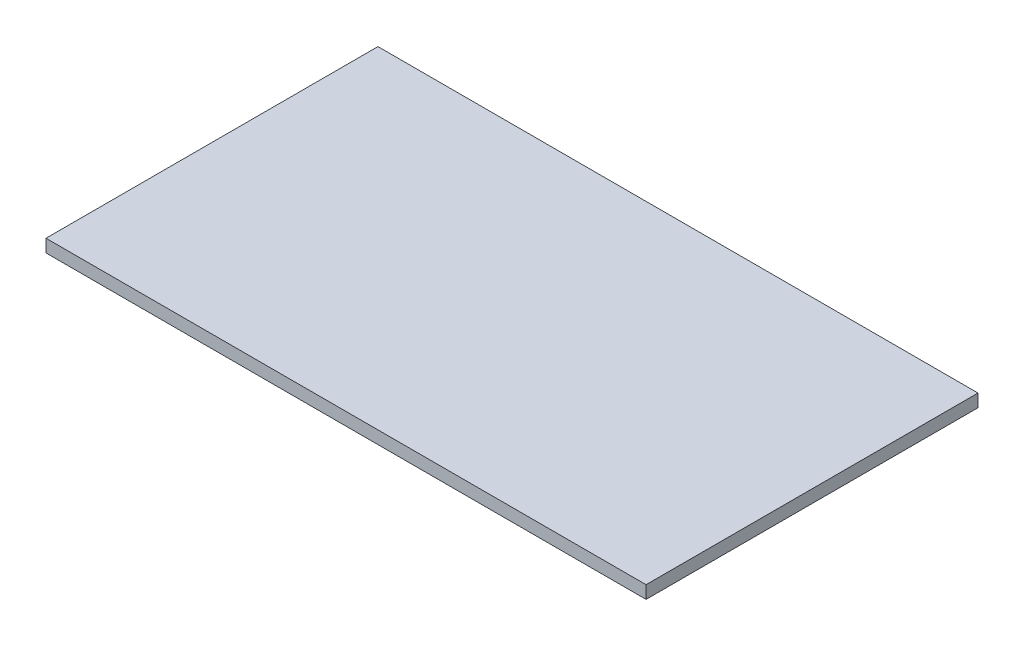
ISO-10303-21;
HEADER;
FILE_DESCRIPTION(('STEP AP214'),'2;1');
FILE_NAME('part.step','',(''),(''),'','','');
FILE_SCHEMA(('AUTOMOTIVE_DESIGN { 1 0 10303 214 1 1 1 1 }'));
ENDSEC;
DATA;
#1=APPLICATION_CONTEXT('core data for automotive mechanical design processes');
#2=APPLICATION_PROTOCOL_DEFINITION('international standard','automotive_design',2000,#1);
#3=PRODUCT_CONTEXT('',#1,'mechanical');
#4=PRODUCT('Part','Part','',(#3));
#5=PRODUCT_RELATED_PRODUCT_CATEGORY('part','',(#4));
#6=PRODUCT_DEFINITION_FORMATION('','',#4);
#7=PRODUCT_DEFINITION_CONTEXT('part definition',#1,'design');
#8=PRODUCT_DEFINITION('design','',#6,#7);
#9=PRODUCT_DEFINITION_SHAPE('','',#8);
#10=(LENGTH_UNIT() NAMED_UNIT(*) SI_UNIT(.MILLI.,.METRE.));
#11=(NAMED_UNIT(*) PLANE_ANGLE_UNIT() SI_UNIT($,.RADIAN.));
#12=(NAMED_UNIT(*) SI_UNIT($,.STERADIAN.) SOLID_ANGLE_UNIT());
#13=UNCERTAINTY_MEASURE_WITH_UNIT(LENGTH_MEASURE(1.E-05),#10,'distance_accuracy_value','');
#14=(GEOMETRIC_REPRESENTATION_CONTEXT(3) GLOBAL_UNCERTAINTY_ASSIGNED_CONTEXT((#13)) GLOBAL_UNIT_ASSIGNED_CONTEXT((#10,
#11,#12)) REPRESENTATION_CONTEXT('',''));
#15=CARTESIAN_POINT('',(0.,0.,0.));
#16=DIRECTION('',(0.,0.,1.));
#17=DIRECTION('',(1.,0.,0.));
#18=AXIS2_PLACEMENT_3D('',#15,#16,#17);
#19=CARTESIAN_POINT('',(149.225,6.35,82.55));
#20=DIRECTION('',(-1.,0.,0.));
#21=DIRECTION('',(0.,0.,1.));
#22=AXIS2_PLACEMENT_3D('',#19,#20,#21);
#23=PLANE('',#22);
#24=DIRECTION('',(0.,0.,-1.));
#25=VECTOR('',#24,1.);
#26=CARTESIAN_POINT('',(149.225,0.,82.55));
#27=LINE('',#26,#25);
#28=CARTESIAN_POINT('',(149.225,0.,82.55));
#29=VERTEX_POINT('',#28);
#30=CARTESIAN_POINT('',(149.225,0.,-82.55));
#31=VERTEX_POINT('',#30);
#32=EDGE_CURVE('E98',#29,#31,#27,.T.);
#33=ORIENTED_EDGE('',*,*,#32,.T.);
#34=DIRECTION('',(0.,-1.,0.));
#35=VECTOR('',#34,1.);
#36=CARTESIAN_POINT('',(149.225,6.35,-82.55));
#37=LINE('',#36,#35);
#38=CARTESIAN_POINT('',(149.225,6.35,-82.55));
#39=VERTEX_POINT('',#38);
#40=EDGE_CURVE('E11',#39,#31,#37,.T.);
#41=ORIENTED_EDGE('',*,*,#40,.F.);
#42=DIRECTION('',(0.,0.,-1.));
#43=VECTOR('',#42,1.);
#44=CARTESIAN_POINT('',(149.225,6.35,82.55));
#45=LINE('',#44,#43);
#46=CARTESIAN_POINT('',(149.225,6.35,82.55));
#47=VERTEX_POINT('',#46);
#48=EDGE_CURVE('E86',#47,#39,#45,.T.);
#49=ORIENTED_EDGE('',*,*,#48,.F.);
#50=DIRECTION('',(0.,-1.,0.));
#51=VECTOR('',#50,1.);
#52=CARTESIAN_POINT('',(149.225,6.35,82.55));
#53=LINE('',#52,#51);
#54=EDGE_CURVE('E94',#47,#29,#53,.T.);
#55=ORIENTED_EDGE('',*,*,#54,.T.);
#56=EDGE_LOOP('',(#33,#41,#49,#55));
#57=FACE_BOUND('',#56,.T.);
#58=ADVANCED_FACE('F35',(#57),#23,.F.);
#59=CARTESIAN_POINT('',(-149.225,6.35,-82.55));
#60=DIRECTION('',(0.,0.,1.));
#61=DIRECTION('',(1.,0.,0.));
#62=AXIS2_PLACEMENT_3D('',#59,#60,#61);
#63=PLANE('',#62);
#64=DIRECTION('',(-1.,0.,0.));
#65=VECTOR('',#64,1.);
#66=CARTESIAN_POINT('',(-149.225,0.,-82.55));
#67=LINE('',#66,#65);
#68=CARTESIAN_POINT('',(-149.225,0.,-82.55));
#69=VERTEX_POINT('',#68);
#70=EDGE_CURVE('E90',#31,#69,#67,.T.);
#71=ORIENTED_EDGE('',*,*,#70,.T.);
#72=DIRECTION('',(0.,-1.,0.));
#73=VECTOR('',#72,1.);
#74=CARTESIAN_POINT('',(-149.225,6.35,-82.55));
#75=LINE('',#74,#73);
#76=CARTESIAN_POINT('',(-149.225,6.35,-82.55));
#77=VERTEX_POINT('',#76);
#78=EDGE_CURVE('E43',#77,#69,#75,.T.);
#79=ORIENTED_EDGE('',*,*,#78,.F.);
#80=DIRECTION('',(-1.,0.,0.));
#81=VECTOR('',#80,1.);
#82=CARTESIAN_POINT('',(-149.225,6.35,-82.55));
#83=LINE('',#82,#81);
#84=EDGE_CURVE('E81',#39,#77,#83,.T.);
#85=ORIENTED_EDGE('',*,*,#84,.F.);
#86=ORIENTED_EDGE('',*,*,#40,.T.);
#87=EDGE_LOOP('',(#71,#79,#85,#86));
#88=FACE_BOUND('',#87,.T.);
#89=ADVANCED_FACE('F89',(#88),#63,.F.);
#90=CARTESIAN_POINT('',(-149.225,6.35,82.55));
#91=DIRECTION('',(1.,0.,0.));
#92=DIRECTION('',(0.,0.,-1.));
#93=AXIS2_PLACEMENT_3D('',#90,#91,#92);
#94=PLANE('',#93);
#95=DIRECTION('',(0.,0.,1.));
#96=VECTOR('',#95,1.);
#97=CARTESIAN_POINT('',(-149.225,0.,82.55));
#98=LINE('',#97,#96);
#99=CARTESIAN_POINT('',(-149.225,0.,82.55));
#100=VERTEX_POINT('',#99);
#101=EDGE_CURVE('E68',#69,#100,#98,.T.);
#102=ORIENTED_EDGE('',*,*,#101,.T.);
#103=DIRECTION('',(0.,-1.,0.));
#104=VECTOR('',#103,1.);
#105=CARTESIAN_POINT('',(-149.225,6.35,82.55));
#106=LINE('',#105,#104);
#107=CARTESIAN_POINT('',(-149.225,6.35,82.55));
#108=VERTEX_POINT('',#107);
#109=EDGE_CURVE('E91',#108,#100,#106,.T.);
#110=ORIENTED_EDGE('',*,*,#109,.F.);
#111=DIRECTION('',(0.,0.,1.));
#112=VECTOR('',#111,1.);
#113=CARTESIAN_POINT('',(-149.225,6.35,82.55));
#114=LINE('',#113,#112);
#115=EDGE_CURVE('E84',#77,#108,#114,.T.);
#116=ORIENTED_EDGE('',*,*,#115,.F.);
#117=ORIENTED_EDGE('',*,*,#78,.T.);
#118=EDGE_LOOP('',(#102,#110,#116,#117));
#119=FACE_BOUND('',#118,.T.);
#120=ADVANCED_FACE('F92',(#119),#94,.F.);
#121=CARTESIAN_POINT('',(-149.225,6.35,82.55));
#122=DIRECTION('',(0.,0.,-1.));
#123=DIRECTION('',(-1.,0.,0.));
#124=AXIS2_PLACEMENT_3D('',#121,#122,#123);
#125=PLANE('',#124);
#126=DIRECTION('',(1.,0.,0.));
#127=VECTOR('',#126,1.);
#128=CARTESIAN_POINT('',(-149.225,0.,82.55));
#129=LINE('',#128,#127);
#130=EDGE_CURVE('E74',#100,#29,#129,.T.);
#131=ORIENTED_EDGE('',*,*,#130,.T.);
#132=ORIENTED_EDGE('',*,*,#54,.F.);
#133=DIRECTION('',(1.,0.,0.));
#134=VECTOR('',#133,1.);
#135=CARTESIAN_POINT('',(-149.225,6.35,82.55));
#136=LINE('',#135,#134);
#137=EDGE_CURVE('E51',#108,#47,#136,.T.);
#138=ORIENTED_EDGE('',*,*,#137,.F.);
#139=ORIENTED_EDGE('',*,*,#109,.T.);
#140=EDGE_LOOP('',(#131,#132,#138,#139));
#141=FACE_BOUND('',#140,.T.);
#142=ADVANCED_FACE('F105',(#141),#125,.F.);
#143=CARTESIAN_POINT('',(0.,6.35,0.));
#144=DIRECTION('',(0.,-1.,0.));
#145=DIRECTION('',(0.,0.,-1.));
#146=AXIS2_PLACEMENT_3D('',#143,#144,#145);
#147=PLANE('',#146);
#148=ORIENTED_EDGE('',*,*,#48,.T.);
#149=ORIENTED_EDGE('',*,*,#84,.T.);
#150=ORIENTED_EDGE('',*,*,#115,.T.);
#151=ORIENTED_EDGE('',*,*,#137,.T.);
#152=EDGE_LOOP('',(#148,#149,#150,#151));
#153=FACE_BOUND('',#152,.T.);
#154=ADVANCED_FACE('F82',(#153),#147,.F.);
#155=CARTESIAN_POINT('',(0.,0.,0.));
#156=DIRECTION('',(0.,-1.,0.));
#157=DIRECTION('',(0.,0.,-1.));
#158=AXIS2_PLACEMENT_3D('',#155,#156,#157);
#159=PLANE('',#158);
#160=ORIENTED_EDGE('',*,*,#32,.F.);
#161=ORIENTED_EDGE('',*,*,#130,.F.);
#162=ORIENTED_EDGE('',*,*,#101,.F.);
#163=ORIENTED_EDGE('',*,*,#70,.F.);
#164=EDGE_LOOP('',(#160,#161,#162,#163));
#165=FACE_BOUND('',#164,.T.);
#166=ADVANCED_FACE('F108',(#165),#159,.T.);
#167=CLOSED_SHELL('',(#58,#89,#120,#142,#154,#166));
#168=MANIFOLD_SOLID_BREP('B2',#167);
#169=ADVANCED_BREP_SHAPE_REPRESENTATION('',(#18,#168),#14);
#170=SHAPE_DEFINITION_REPRESENTATION(#9,#169);
ENDSEC;
END-ISO-10303-21;
